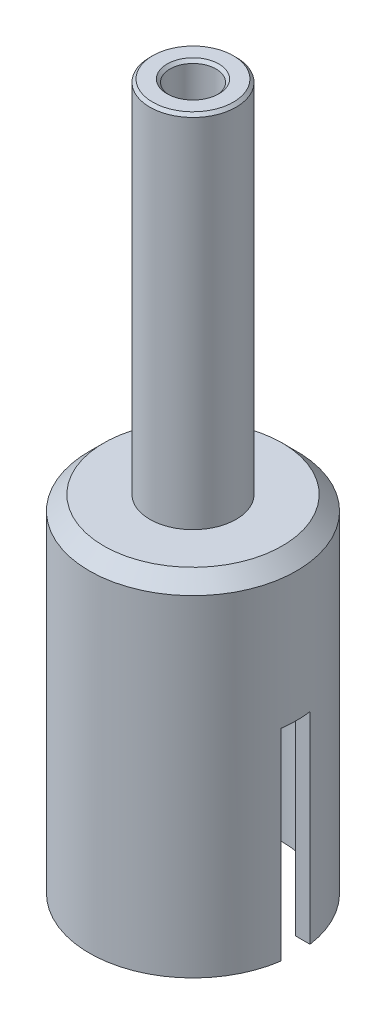
ISO-10303-21;
HEADER;
FILE_DESCRIPTION(('STEP AP214'),'2;1');
FILE_NAME('part.step','',(''),(''),'','','');
FILE_SCHEMA(('AUTOMOTIVE_DESIGN { 1 0 10303 214 1 1 1 1 }'));
ENDSEC;
DATA;
#1=APPLICATION_CONTEXT('core data for automotive mechanical design processes');
#2=APPLICATION_PROTOCOL_DEFINITION('international standard','automotive_design',2000,#1);
#3=PRODUCT_CONTEXT('',#1,'mechanical');
#4=PRODUCT('Part','Part','',(#3));
#5=PRODUCT_RELATED_PRODUCT_CATEGORY('part','',(#4));
#6=PRODUCT_DEFINITION_FORMATION('','',#4);
#7=PRODUCT_DEFINITION_CONTEXT('part definition',#1,'design');
#8=PRODUCT_DEFINITION('design','',#6,#7);
#9=PRODUCT_DEFINITION_SHAPE('','',#8);
#10=(LENGTH_UNIT() NAMED_UNIT(*) SI_UNIT(.MILLI.,.METRE.));
#11=(NAMED_UNIT(*) PLANE_ANGLE_UNIT() SI_UNIT($,.RADIAN.));
#12=(NAMED_UNIT(*) SI_UNIT($,.STERADIAN.) SOLID_ANGLE_UNIT());
#13=UNCERTAINTY_MEASURE_WITH_UNIT(LENGTH_MEASURE(1.E-05),#10,'distance_accuracy_value','');
#14=(GEOMETRIC_REPRESENTATION_CONTEXT(3) GLOBAL_UNCERTAINTY_ASSIGNED_CONTEXT((#13)) GLOBAL_UNIT_ASSIGNED_CONTEXT((#10,
#11,#12)) REPRESENTATION_CONTEXT('',''));
#15=CARTESIAN_POINT('',(0.,0.,0.));
#16=DIRECTION('',(0.,0.,1.));
#17=DIRECTION('',(1.,0.,0.));
#18=AXIS2_PLACEMENT_3D('',#15,#16,#17);
#19=CARTESIAN_POINT('',(0.,0.,0.));
#20=DIRECTION('',(0.,1.,0.));
#21=DIRECTION('',(0.,0.,1.));
#22=AXIS2_PLACEMENT_3D('',#19,#20,#21);
#23=PLANE('',#22);
#24=CARTESIAN_POINT('',(0.,0.,0.));
#25=DIRECTION('',(0.,1.,0.));
#26=DIRECTION('',(0.,0.,1.));
#27=AXIS2_PLACEMENT_3D('',#24,#25,#26);
#28=CIRCLE('',#27,36.);
#29=CARTESIAN_POINT('',(35.6510869399518,0.,-5.));
#30=VERTEX_POINT('',#29);
#31=CARTESIAN_POINT('',(-35.6510869399518,0.,-5.));
#32=VERTEX_POINT('',#31);
#33=EDGE_CURVE('E127',#30,#32,#28,.T.);
#34=ORIENTED_EDGE('',*,*,#33,.F.);
#35=DIRECTION('',(1.,0.,0.));
#36=VECTOR('',#35,1.);
#37=CARTESIAN_POINT('',(-44.1687105356388,0.,-5.));
#38=LINE('',#37,#36);
#39=CARTESIAN_POINT('',(30.5941170815567,0.,-5.));
#40=VERTEX_POINT('',#39);
#41=EDGE_CURVE('E120',#40,#30,#38,.T.);
#42=ORIENTED_EDGE('',*,*,#41,.F.);
#43=CARTESIAN_POINT('',(0.,0.,0.));
#44=DIRECTION('',(0.,-1.,0.));
#45=DIRECTION('',(0.,0.,-1.));
#46=AXIS2_PLACEMENT_3D('',#43,#44,#45);
#47=CIRCLE('',#46,31.);
#48=CARTESIAN_POINT('',(-30.5941170815567,0.,-5.));
#49=VERTEX_POINT('',#48);
#50=EDGE_CURVE('E136',#49,#40,#47,.T.);
#51=ORIENTED_EDGE('',*,*,#50,.F.);
#52=EDGE_CURVE('E175',#32,#49,#38,.T.);
#53=ORIENTED_EDGE('',*,*,#52,.F.);
#54=EDGE_LOOP('',(#34,#42,#51,#53));
#55=FACE_BOUND('',#54,.T.);
#56=ADVANCED_FACE('F37',(#55),#23,.F.);
#57=CARTESIAN_POINT('',(0.,120.,0.));
#58=DIRECTION('',(0.,1.,0.));
#59=DIRECTION('',(0.,0.,1.));
#60=AXIS2_PLACEMENT_3D('',#57,#58,#59);
#61=PLANE('',#60);
#62=CARTESIAN_POINT('',(0.,120.,0.));
#63=DIRECTION('',(0.,1.,0.));
#64=DIRECTION('',(0.,0.,1.));
#65=AXIS2_PLACEMENT_3D('',#62,#63,#64);
#66=CIRCLE('',#65,30.9999999999999);
#67=CARTESIAN_POINT('',(0.,120.,30.9999999999999));
#68=VERTEX_POINT('',#67);
#69=EDGE_CURVE('E131',#68,#68,#66,.T.);
#70=ORIENTED_EDGE('',*,*,#69,.T.);
#71=EDGE_LOOP('',(#70));
#72=FACE_BOUND('',#71,.T.);
#73=CARTESIAN_POINT('',(0.,120.,0.));
#74=DIRECTION('',(0.,1.,0.));
#75=DIRECTION('',(0.,0.,1.));
#76=AXIS2_PLACEMENT_3D('',#73,#74,#75);
#77=CIRCLE('',#76,15.);
#78=CARTESIAN_POINT('',(0.,120.,15.));
#79=VERTEX_POINT('',#78);
#80=EDGE_CURVE('E194',#79,#79,#77,.T.);
#81=ORIENTED_EDGE('',*,*,#80,.F.);
#82=EDGE_LOOP('',(#81));
#83=FACE_BOUND('',#82,.T.);
#84=ADVANCED_FACE('F217',(#72,#83),#61,.T.);
#85=CARTESIAN_POINT('',(0.,120.,0.));
#86=DIRECTION('',(0.,-1.,0.));
#87=DIRECTION('',(0.,0.,-1.));
#88=AXIS2_PLACEMENT_3D('',#85,#86,#87);
#89=CYLINDRICAL_SURFACE('',#88,36.);
#90=CARTESIAN_POINT('',(0.,70.,0.));
#91=DIRECTION('',(0.,1.,0.));
#92=DIRECTION('',(0.,0.,1.));
#93=AXIS2_PLACEMENT_3D('',#90,#91,#92);
#94=CIRCLE('',#93,36.);
#95=CARTESIAN_POINT('',(35.6510869399518,70.,5.));
#96=VERTEX_POINT('',#95);
#97=CARTESIAN_POINT('',(35.6510869399518,70.,-5.));
#98=VERTEX_POINT('',#97);
#99=EDGE_CURVE('E110',#96,#98,#94,.T.);
#100=ORIENTED_EDGE('',*,*,#99,.T.);
#101=DIRECTION('',(0.,-1.,0.));
#102=VECTOR('',#101,1.);
#103=CARTESIAN_POINT('',(35.6510869399518,120.,-5.));
#104=LINE('',#103,#102);
#105=EDGE_CURVE('E188',#98,#30,#104,.T.);
#106=ORIENTED_EDGE('',*,*,#105,.T.);
#107=ORIENTED_EDGE('',*,*,#33,.T.);
#108=DIRECTION('',(0.,-1.,0.));
#109=VECTOR('',#108,1.);
#110=CARTESIAN_POINT('',(-35.6510869399518,120.,-5.));
#111=LINE('',#110,#109);
#112=CARTESIAN_POINT('',(-35.6510869399518,70.,-5.));
#113=VERTEX_POINT('',#112);
#114=EDGE_CURVE('E185',#32,#113,#111,.F.);
#115=ORIENTED_EDGE('',*,*,#114,.T.);
#116=CARTESIAN_POINT('',(-35.6510869399518,70.,5.));
#117=VERTEX_POINT('',#116);
#118=EDGE_CURVE('E182',#113,#117,#94,.T.);
#119=ORIENTED_EDGE('',*,*,#118,.T.);
#120=DIRECTION('',(0.,-1.,0.));
#121=VECTOR('',#120,1.);
#122=CARTESIAN_POINT('',(-35.6510869399518,120.,5.));
#123=LINE('',#122,#121);
#124=CARTESIAN_POINT('',(-35.6510869399518,0.,5.));
#125=VERTEX_POINT('',#124);
#126=EDGE_CURVE('E109',#117,#125,#123,.T.);
#127=ORIENTED_EDGE('',*,*,#126,.T.);
#128=CARTESIAN_POINT('',(35.6510869399518,0.,5.));
#129=VERTEX_POINT('',#128);
#130=EDGE_CURVE('E117',#125,#129,#28,.T.);
#131=ORIENTED_EDGE('',*,*,#130,.T.);
#132=DIRECTION('',(0.,-1.,0.));
#133=VECTOR('',#132,1.);
#134=CARTESIAN_POINT('',(35.6510869399518,120.,5.));
#135=LINE('',#134,#133);
#136=EDGE_CURVE('E101',#129,#96,#135,.F.);
#137=ORIENTED_EDGE('',*,*,#136,.T.);
#138=EDGE_LOOP('',(#100,#106,#107,#115,#119,#127,#131,#137));
#139=FACE_BOUND('',#138,.T.);
#140=CARTESIAN_POINT('',(0.,115.,0.));
#141=DIRECTION('',(0.,1.,0.));
#142=DIRECTION('',(0.,0.,1.));
#143=AXIS2_PLACEMENT_3D('',#140,#141,#142);
#144=CIRCLE('',#143,36.);
#145=CARTESIAN_POINT('',(0.,115.,36.));
#146=VERTEX_POINT('',#145);
#147=EDGE_CURVE('E139',#146,#146,#144,.F.);
#148=ORIENTED_EDGE('',*,*,#147,.T.);
#149=EDGE_LOOP('',(#148));
#150=FACE_BOUND('',#149,.T.);
#151=ADVANCED_FACE('F124',(#139,#150),#89,.T.);
#152=ORIENTED_EDGE('',*,*,#130,.F.);
#153=DIRECTION('',(-1.,0.,0.));
#154=VECTOR('',#153,1.);
#155=CARTESIAN_POINT('',(-44.1687105356388,0.,5.));
#156=LINE('',#155,#154);
#157=CARTESIAN_POINT('',(-30.5941170815567,0.,5.));
#158=VERTEX_POINT('',#157);
#159=EDGE_CURVE('E121',#158,#125,#156,.T.);
#160=ORIENTED_EDGE('',*,*,#159,.F.);
#161=CARTESIAN_POINT('',(30.5941170815567,0.,5.));
#162=VERTEX_POINT('',#161);
#163=EDGE_CURVE('E119',#162,#158,#47,.T.);
#164=ORIENTED_EDGE('',*,*,#163,.F.);
#165=EDGE_CURVE('E104',#129,#162,#156,.T.);
#166=ORIENTED_EDGE('',*,*,#165,.F.);
#167=EDGE_LOOP('',(#152,#160,#164,#166));
#168=FACE_BOUND('',#167,.T.);
#169=ADVANCED_FACE('F115',(#168),#23,.F.);
#170=CARTESIAN_POINT('',(0.,110.,0.));
#171=DIRECTION('',(0.,-1.,0.));
#172=DIRECTION('',(0.,0.,-1.));
#173=AXIS2_PLACEMENT_3D('',#170,#171,#172);
#174=CYLINDRICAL_SURFACE('',#173,31.);
#175=CARTESIAN_POINT('',(0.,70.,0.));
#176=DIRECTION('',(0.,1.,0.));
#177=DIRECTION('',(0.,0.,1.));
#178=AXIS2_PLACEMENT_3D('',#175,#176,#177);
#179=CIRCLE('',#178,31.);
#180=CARTESIAN_POINT('',(-30.5941170815567,70.,5.));
#181=VERTEX_POINT('',#180);
#182=CARTESIAN_POINT('',(-30.5941170815567,70.,-5.));
#183=VERTEX_POINT('',#182);
#184=EDGE_CURVE('E158',#181,#183,#179,.F.);
#185=ORIENTED_EDGE('',*,*,#184,.T.);
#186=DIRECTION('',(0.,-1.,0.));
#187=VECTOR('',#186,1.);
#188=CARTESIAN_POINT('',(-30.5941170815567,110.,-5.));
#189=LINE('',#188,#187);
#190=EDGE_CURVE('E11',#183,#49,#189,.T.);
#191=ORIENTED_EDGE('',*,*,#190,.T.);
#192=ORIENTED_EDGE('',*,*,#50,.T.);
#193=DIRECTION('',(0.,-1.,0.));
#194=VECTOR('',#193,1.);
#195=CARTESIAN_POINT('',(30.5941170815567,110.,-5.));
#196=LINE('',#195,#194);
#197=CARTESIAN_POINT('',(30.5941170815567,70.,-5.));
#198=VERTEX_POINT('',#197);
#199=EDGE_CURVE('E160',#40,#198,#196,.F.);
#200=ORIENTED_EDGE('',*,*,#199,.T.);
#201=CARTESIAN_POINT('',(30.5941170815567,70.,5.));
#202=VERTEX_POINT('',#201);
#203=EDGE_CURVE('E154',#198,#202,#179,.F.);
#204=ORIENTED_EDGE('',*,*,#203,.T.);
#205=DIRECTION('',(0.,-1.,0.));
#206=VECTOR('',#205,1.);
#207=CARTESIAN_POINT('',(30.5941170815567,110.,5.));
#208=LINE('',#207,#206);
#209=EDGE_CURVE('E157',#202,#162,#208,.T.);
#210=ORIENTED_EDGE('',*,*,#209,.T.);
#211=ORIENTED_EDGE('',*,*,#163,.T.);
#212=DIRECTION('',(0.,-1.,0.));
#213=VECTOR('',#212,1.);
#214=CARTESIAN_POINT('',(-30.5941170815567,110.,5.));
#215=LINE('',#214,#213);
#216=EDGE_CURVE('E45',#158,#181,#215,.F.);
#217=ORIENTED_EDGE('',*,*,#216,.T.);
#218=EDGE_LOOP('',(#185,#191,#192,#200,#204,#210,#211,#217));
#219=FACE_BOUND('',#218,.T.);
#220=CARTESIAN_POINT('',(0.,110.,0.));
#221=DIRECTION('',(0.,-1.,0.));
#222=DIRECTION('',(0.,0.,-1.));
#223=AXIS2_PLACEMENT_3D('',#220,#221,#222);
#224=CIRCLE('',#223,31.);
#225=CARTESIAN_POINT('',(0.,110.,-31.));
#226=VERTEX_POINT('',#225);
#227=EDGE_CURVE('E128',#226,#226,#224,.T.);
#228=ORIENTED_EDGE('',*,*,#227,.F.);
#229=EDGE_LOOP('',(#228));
#230=FACE_BOUND('',#229,.T.);
#231=ADVANCED_FACE('F165',(#219,#230),#174,.F.);
#232=CARTESIAN_POINT('',(0.,110.,0.));
#233=DIRECTION('',(0.,-1.,0.));
#234=DIRECTION('',(0.,0.,-1.));
#235=AXIS2_PLACEMENT_3D('',#232,#233,#234);
#236=PLANE('',#235);
#237=CARTESIAN_POINT('',(0.,110.,0.));
#238=DIRECTION('',(0.,-1.,0.));
#239=DIRECTION('',(0.,0.,-1.));
#240=AXIS2_PLACEMENT_3D('',#237,#238,#239);
#241=CIRCLE('',#240,8.);
#242=CARTESIAN_POINT('',(0.,110.,-8.));
#243=VERTEX_POINT('',#242);
#244=EDGE_CURVE('E191',#243,#243,#241,.T.);
#245=ORIENTED_EDGE('',*,*,#244,.F.);
#246=EDGE_LOOP('',(#245));
#247=FACE_BOUND('',#246,.T.);
#248=ORIENTED_EDGE('',*,*,#227,.T.);
#249=EDGE_LOOP('',(#248));
#250=FACE_BOUND('',#249,.T.);
#251=ADVANCED_FACE('F230',(#247,#250),#236,.T.);
#252=CARTESIAN_POINT('',(0.,120.,0.));
#253=DIRECTION('',(0.,-1.,0.));
#254=DIRECTION('',(0.,0.,-1.));
#255=AXIS2_PLACEMENT_3D('',#252,#253,#254);
#256=CONICAL_SURFACE('',#255,30.9999999999999,0.785398163397446);
#257=ORIENTED_EDGE('',*,*,#147,.F.);
#258=EDGE_LOOP('',(#257));
#259=FACE_BOUND('',#258,.T.);
#260=ORIENTED_EDGE('',*,*,#69,.F.);
#261=EDGE_LOOP('',(#260));
#262=FACE_BOUND('',#261,.T.);
#263=ADVANCED_FACE('F235',(#259,#262),#256,.T.);
#264=CARTESIAN_POINT('',(0.,245.,0.));
#265=DIRECTION('',(0.,-1.,0.));
#266=DIRECTION('',(0.,0.,-1.));
#267=AXIS2_PLACEMENT_3D('',#264,#265,#266);
#268=CYLINDRICAL_SURFACE('',#267,15.);
#269=CARTESIAN_POINT('',(0.,244.,0.));
#270=DIRECTION('',(0.,1.,0.));
#271=DIRECTION('',(0.,0.,1.));
#272=AXIS2_PLACEMENT_3D('',#269,#270,#271);
#273=CIRCLE('',#272,15.);
#274=CARTESIAN_POINT('',(0.,244.,15.));
#275=VERTEX_POINT('',#274);
#276=EDGE_CURVE('E151',#275,#275,#273,.F.);
#277=ORIENTED_EDGE('',*,*,#276,.T.);
#278=EDGE_LOOP('',(#277));
#279=FACE_BOUND('',#278,.T.);
#280=ORIENTED_EDGE('',*,*,#80,.T.);
#281=EDGE_LOOP('',(#280));
#282=FACE_BOUND('',#281,.T.);
#283=ADVANCED_FACE('F237',(#279,#282),#268,.T.);
#284=CARTESIAN_POINT('',(0.,245.,0.));
#285=DIRECTION('',(0.,1.,0.));
#286=DIRECTION('',(0.,0.,1.));
#287=AXIS2_PLACEMENT_3D('',#284,#285,#286);
#288=PLANE('',#287);
#289=CARTESIAN_POINT('',(0.,245.,0.));
#290=DIRECTION('',(0.,1.,0.));
#291=DIRECTION('',(0.,0.,1.));
#292=AXIS2_PLACEMENT_3D('',#289,#290,#291);
#293=CIRCLE('',#292,9.00000000000001);
#294=CARTESIAN_POINT('',(0.,245.,9.00000000000001));
#295=VERTEX_POINT('',#294);
#296=EDGE_CURVE('E148',#295,#295,#293,.F.);
#297=ORIENTED_EDGE('',*,*,#296,.T.);
#298=EDGE_LOOP('',(#297));
#299=FACE_BOUND('',#298,.T.);
#300=CARTESIAN_POINT('',(0.,245.,0.));
#301=DIRECTION('',(0.,1.,0.));
#302=DIRECTION('',(0.,0.,1.));
#303=AXIS2_PLACEMENT_3D('',#300,#301,#302);
#304=CIRCLE('',#303,14.);
#305=CARTESIAN_POINT('',(0.,245.,14.));
#306=VERTEX_POINT('',#305);
#307=EDGE_CURVE('E145',#306,#306,#304,.T.);
#308=ORIENTED_EDGE('',*,*,#307,.T.);
#309=EDGE_LOOP('',(#308));
#310=FACE_BOUND('',#309,.T.);
#311=ADVANCED_FACE('F248',(#299,#310),#288,.T.);
#312=CARTESIAN_POINT('',(0.,0.,0.));
#313=DIRECTION('',(0.,1.,0.));
#314=DIRECTION('',(0.,0.,1.));
#315=AXIS2_PLACEMENT_3D('',#312,#313,#314);
#316=CYLINDRICAL_SURFACE('',#315,8.);
#317=CARTESIAN_POINT('',(0.,244.,0.));
#318=DIRECTION('',(0.,1.,0.));
#319=DIRECTION('',(0.,0.,1.));
#320=AXIS2_PLACEMENT_3D('',#317,#318,#319);
#321=CIRCLE('',#320,8.);
#322=CARTESIAN_POINT('',(0.,244.,8.));
#323=VERTEX_POINT('',#322);
#324=EDGE_CURVE('E142',#323,#323,#321,.T.);
#325=ORIENTED_EDGE('',*,*,#324,.T.);
#326=EDGE_LOOP('',(#325));
#327=FACE_BOUND('',#326,.T.);
#328=ORIENTED_EDGE('',*,*,#244,.T.);
#329=EDGE_LOOP('',(#328));
#330=FACE_BOUND('',#329,.T.);
#331=ADVANCED_FACE('F241',(#327,#330),#316,.F.);
#332=CARTESIAN_POINT('',(0.,244.,0.));
#333=DIRECTION('',(0.,1.,0.));
#334=DIRECTION('',(0.,0.,1.));
#335=AXIS2_PLACEMENT_3D('',#332,#333,#334);
#336=CONICAL_SURFACE('',#335,8.,0.785398163397466);
#337=ORIENTED_EDGE('',*,*,#296,.F.);
#338=EDGE_LOOP('',(#337));
#339=FACE_BOUND('',#338,.T.);
#340=ORIENTED_EDGE('',*,*,#324,.F.);
#341=EDGE_LOOP('',(#340));
#342=FACE_BOUND('',#341,.T.);
#343=ADVANCED_FACE('F239',(#339,#342),#336,.F.);
#344=CARTESIAN_POINT('',(0.,245.,0.));
#345=DIRECTION('',(0.,-1.,0.));
#346=DIRECTION('',(0.,0.,-1.));
#347=AXIS2_PLACEMENT_3D('',#344,#345,#346);
#348=CONICAL_SURFACE('',#347,14.,0.78539816339747);
#349=ORIENTED_EDGE('',*,*,#276,.F.);
#350=EDGE_LOOP('',(#349));
#351=FACE_BOUND('',#350,.T.);
#352=ORIENTED_EDGE('',*,*,#307,.F.);
#353=EDGE_LOOP('',(#352));
#354=FACE_BOUND('',#353,.T.);
#355=ADVANCED_FACE('F39',(#351,#354),#348,.T.);
#356=CARTESIAN_POINT('',(44.1687105356389,70.,5.));
#357=DIRECTION('',(0.,1.,0.));
#358=DIRECTION('',(0.,0.,1.));
#359=AXIS2_PLACEMENT_3D('',#356,#357,#358);
#360=PLANE('',#359);
#361=DIRECTION('',(-1.,0.,0.));
#362=VECTOR('',#361,1.);
#363=CARTESIAN_POINT('',(-44.1687105356388,70.,5.));
#364=LINE('',#363,#362);
#365=EDGE_CURVE('E60',#96,#202,#364,.T.);
#366=ORIENTED_EDGE('',*,*,#365,.T.);
#367=ORIENTED_EDGE('',*,*,#203,.F.);
#368=DIRECTION('',(1.,0.,0.));
#369=VECTOR('',#368,1.);
#370=CARTESIAN_POINT('',(-44.1687105356388,70.,-5.));
#371=LINE('',#370,#369);
#372=EDGE_CURVE('E177',#198,#98,#371,.T.);
#373=ORIENTED_EDGE('',*,*,#372,.T.);
#374=ORIENTED_EDGE('',*,*,#99,.F.);
#375=EDGE_LOOP('',(#366,#367,#373,#374));
#376=FACE_BOUND('',#375,.T.);
#377=ADVANCED_FACE('F199',(#376),#360,.F.);
#378=CARTESIAN_POINT('',(-44.1687105356388,70.,5.));
#379=DIRECTION('',(0.,0.,1.));
#380=DIRECTION('',(1.,0.,0.));
#381=AXIS2_PLACEMENT_3D('',#378,#379,#380);
#382=PLANE('',#381);
#383=ORIENTED_EDGE('',*,*,#165,.T.);
#384=ORIENTED_EDGE('',*,*,#209,.F.);
#385=ORIENTED_EDGE('',*,*,#365,.F.);
#386=ORIENTED_EDGE('',*,*,#136,.F.);
#387=EDGE_LOOP('',(#383,#384,#385,#386));
#388=FACE_BOUND('',#387,.T.);
#389=ADVANCED_FACE('F103',(#388),#382,.F.);
#390=CARTESIAN_POINT('',(-44.1687105356388,70.,-5.));
#391=DIRECTION('',(0.,0.,-1.));
#392=DIRECTION('',(-1.,0.,0.));
#393=AXIS2_PLACEMENT_3D('',#390,#391,#392);
#394=PLANE('',#393);
#395=ORIENTED_EDGE('',*,*,#372,.F.);
#396=ORIENTED_EDGE('',*,*,#199,.F.);
#397=ORIENTED_EDGE('',*,*,#41,.T.);
#398=ORIENTED_EDGE('',*,*,#105,.F.);
#399=EDGE_LOOP('',(#395,#396,#397,#398));
#400=FACE_BOUND('',#399,.T.);
#401=ADVANCED_FACE('F201',(#400),#394,.F.);
#402=ORIENTED_EDGE('',*,*,#52,.T.);
#403=ORIENTED_EDGE('',*,*,#190,.F.);
#404=EDGE_CURVE('E52',#113,#183,#371,.T.);
#405=ORIENTED_EDGE('',*,*,#404,.F.);
#406=ORIENTED_EDGE('',*,*,#114,.F.);
#407=EDGE_LOOP('',(#402,#403,#405,#406));
#408=FACE_BOUND('',#407,.T.);
#409=ADVANCED_FACE('F207',(#408),#394,.F.);
#410=EDGE_CURVE('E172',#181,#117,#364,.T.);
#411=ORIENTED_EDGE('',*,*,#410,.F.);
#412=ORIENTED_EDGE('',*,*,#216,.F.);
#413=ORIENTED_EDGE('',*,*,#159,.T.);
#414=ORIENTED_EDGE('',*,*,#126,.F.);
#415=EDGE_LOOP('',(#411,#412,#413,#414));
#416=FACE_BOUND('',#415,.T.);
#417=ADVANCED_FACE('F174',(#416),#382,.F.);
#418=ORIENTED_EDGE('',*,*,#404,.T.);
#419=ORIENTED_EDGE('',*,*,#184,.F.);
#420=ORIENTED_EDGE('',*,*,#410,.T.);
#421=ORIENTED_EDGE('',*,*,#118,.F.);
#422=EDGE_LOOP('',(#418,#419,#420,#421));
#423=FACE_BOUND('',#422,.T.);
#424=ADVANCED_FACE('F171',(#423),#360,.F.);
#425=CLOSED_SHELL('',(#56,#84,#151,#169,#231,#251,#263,#283,#311,#331,#343,#355,#377,#389,#401,
#409,#417,#424));
#426=MANIFOLD_SOLID_BREP('B2',#425);
#427=ADVANCED_BREP_SHAPE_REPRESENTATION('',(#18,#426),#14);
#428=SHAPE_DEFINITION_REPRESENTATION(#9,#427);
ENDSEC;
END-ISO-10303-21;
